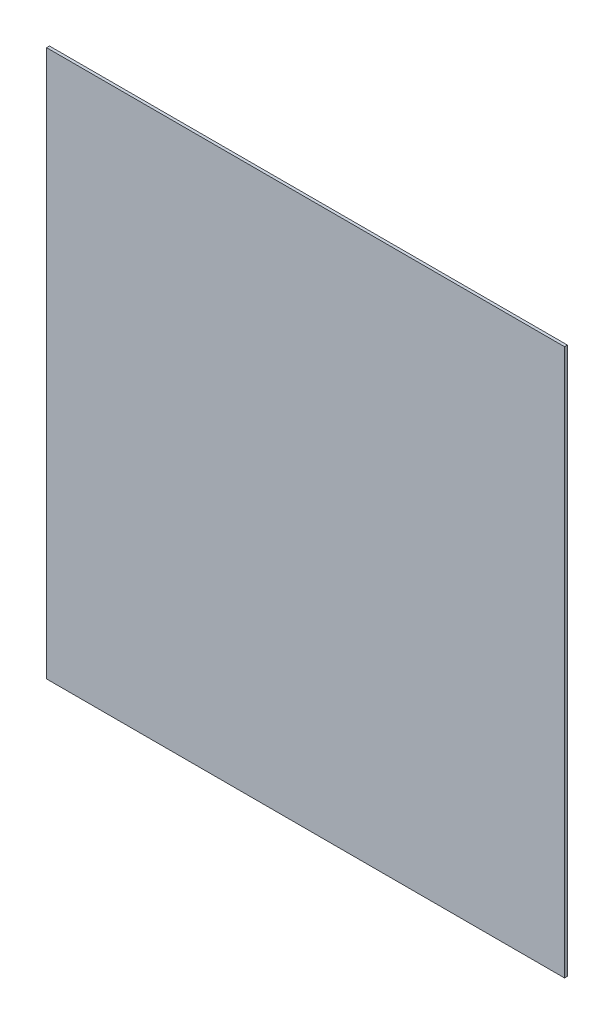
ISO-10303-21;
HEADER;
FILE_DESCRIPTION(('STEP AP214'),'2;1');
FILE_NAME('part.step','',(''),(''),'','','');
FILE_SCHEMA(('AUTOMOTIVE_DESIGN { 1 0 10303 214 1 1 1 1 }'));
ENDSEC;
DATA;
#1=APPLICATION_CONTEXT('core data for automotive mechanical design processes');
#2=APPLICATION_PROTOCOL_DEFINITION('international standard','automotive_design',2000,#1);
#3=PRODUCT_CONTEXT('',#1,'mechanical');
#4=PRODUCT('Part','Part','',(#3));
#5=PRODUCT_RELATED_PRODUCT_CATEGORY('part','',(#4));
#6=PRODUCT_DEFINITION_FORMATION('','',#4);
#7=PRODUCT_DEFINITION_CONTEXT('part definition',#1,'design');
#8=PRODUCT_DEFINITION('design','',#6,#7);
#9=PRODUCT_DEFINITION_SHAPE('','',#8);
#10=(LENGTH_UNIT() NAMED_UNIT(*) SI_UNIT(.MILLI.,.METRE.));
#11=(NAMED_UNIT(*) PLANE_ANGLE_UNIT() SI_UNIT($,.RADIAN.));
#12=(NAMED_UNIT(*) SI_UNIT($,.STERADIAN.) SOLID_ANGLE_UNIT());
#13=UNCERTAINTY_MEASURE_WITH_UNIT(LENGTH_MEASURE(1.E-05),#10,'distance_accuracy_value','');
#14=(GEOMETRIC_REPRESENTATION_CONTEXT(3) GLOBAL_UNCERTAINTY_ASSIGNED_CONTEXT((#13)) GLOBAL_UNIT_ASSIGNED_CONTEXT((#10,
#11,#12)) REPRESENTATION_CONTEXT('',''));
#15=CARTESIAN_POINT('',(0.,0.,0.));
#16=DIRECTION('',(0.,0.,1.));
#17=DIRECTION('',(1.,0.,0.));
#18=AXIS2_PLACEMENT_3D('',#15,#16,#17);
#19=CARTESIAN_POINT('',(0.,0.,0.0862000000000108));
#20=DIRECTION('',(0.,0.,1.));
#21=DIRECTION('',(1.,0.,0.));
#22=AXIS2_PLACEMENT_3D('',#19,#20,#21);
#23=PLANE('',#22);
#24=DIRECTION('',(0.,1.,0.));
#25=VECTOR('',#24,1.);
#26=CARTESIAN_POINT('',(2.0500086,-1.2599924,0.0862000000000108));
#27=LINE('',#26,#25);
#28=CARTESIAN_POINT('',(2.0500086,0.6400038,0.0862000000000108));
#29=VERTEX_POINT('',#28);
#30=CARTESIAN_POINT('',(2.0500086,-1.2599924,0.0862000000000108));
#31=VERTEX_POINT('',#30);
#32=EDGE_CURVE('E68',#29,#31,#27,.F.);
#33=ORIENTED_EDGE('',*,*,#32,.F.);
#34=DIRECTION('',(1.,0.,0.));
#35=VECTOR('',#34,1.);
#36=CARTESIAN_POINT('',(2.0500086,0.6400038,0.0862000000000108));
#37=LINE('',#36,#35);
#38=CARTESIAN_POINT('',(0.2500122,0.6400038,0.0862000000000108));
#39=VERTEX_POINT('',#38);
#40=EDGE_CURVE('E20',#39,#29,#37,.T.);
#41=ORIENTED_EDGE('',*,*,#40,.F.);
#42=DIRECTION('',(0.,1.,0.));
#43=VECTOR('',#42,1.);
#44=CARTESIAN_POINT('',(0.2500122,0.6400038,0.0862000000000108));
#45=LINE('',#44,#43);
#46=CARTESIAN_POINT('',(0.2500122,-1.2599924,0.0862000000000108));
#47=VERTEX_POINT('',#46);
#48=EDGE_CURVE('E58',#47,#39,#45,.T.);
#49=ORIENTED_EDGE('',*,*,#48,.F.);
#50=DIRECTION('',(1.,0.,0.));
#51=VECTOR('',#50,1.);
#52=CARTESIAN_POINT('',(0.2500122,-1.2599924,0.0862000000000108));
#53=LINE('',#52,#51);
#54=EDGE_CURVE('E53',#31,#47,#53,.F.);
#55=ORIENTED_EDGE('',*,*,#54,.F.);
#56=EDGE_LOOP('',(#33,#41,#49,#55));
#57=FACE_BOUND('',#56,.T.);
#58=ADVANCED_FACE('F17',(#57),#23,.T.);
#59=CARTESIAN_POINT('',(2.0500086,0.6400038,0.0762));
#60=DIRECTION('',(0.,1.,0.));
#61=DIRECTION('',(0.,0.,1.));
#62=AXIS2_PLACEMENT_3D('',#59,#60,#61);
#63=PLANE('',#62);
#64=DIRECTION('',(0.,0.,-1.));
#65=VECTOR('',#64,1.);
#66=CARTESIAN_POINT('',(2.0500086,0.6400038,0.0762));
#67=LINE('',#66,#65);
#68=CARTESIAN_POINT('',(2.0500086,0.6400038,0.0762));
#69=VERTEX_POINT('',#68);
#70=EDGE_CURVE('E79',#69,#29,#67,.F.);
#71=ORIENTED_EDGE('',*,*,#70,.F.);
#72=DIRECTION('',(1.,0.,0.));
#73=VECTOR('',#72,1.);
#74=CARTESIAN_POINT('',(0.,0.6400038,0.0762));
#75=LINE('',#74,#73);
#76=CARTESIAN_POINT('',(0.2500122,0.6400038,0.0762));
#77=VERTEX_POINT('',#76);
#78=EDGE_CURVE('E74',#69,#77,#75,.F.);
#79=ORIENTED_EDGE('',*,*,#78,.T.);
#80=DIRECTION('',(0.,0.,1.));
#81=VECTOR('',#80,1.);
#82=CARTESIAN_POINT('',(0.2500122,0.6400038,0.0762));
#83=LINE('',#82,#81);
#84=EDGE_CURVE('E63',#39,#77,#83,.F.);
#85=ORIENTED_EDGE('',*,*,#84,.F.);
#86=ORIENTED_EDGE('',*,*,#40,.T.);
#87=EDGE_LOOP('',(#71,#79,#85,#86));
#88=FACE_BOUND('',#87,.T.);
#89=ADVANCED_FACE('F73',(#88),#63,.T.);
#90=CARTESIAN_POINT('',(0.2500122,0.6400038,0.0762));
#91=DIRECTION('',(-1.,0.,0.));
#92=DIRECTION('',(0.,0.,1.));
#93=AXIS2_PLACEMENT_3D('',#90,#91,#92);
#94=PLANE('',#93);
#95=ORIENTED_EDGE('',*,*,#84,.T.);
#96=DIRECTION('',(0.,1.,0.));
#97=VECTOR('',#96,1.);
#98=CARTESIAN_POINT('',(0.2500122,0.,0.0762));
#99=LINE('',#98,#97);
#100=CARTESIAN_POINT('',(0.2500122,-1.2599924,0.0762));
#101=VERTEX_POINT('',#100);
#102=EDGE_CURVE('E84',#77,#101,#99,.F.);
#103=ORIENTED_EDGE('',*,*,#102,.T.);
#104=DIRECTION('',(0.,0.,-1.));
#105=VECTOR('',#104,1.);
#106=CARTESIAN_POINT('',(0.2500122,-1.2599924,0.0762));
#107=LINE('',#106,#105);
#108=EDGE_CURVE('E65',#47,#101,#107,.T.);
#109=ORIENTED_EDGE('',*,*,#108,.F.);
#110=ORIENTED_EDGE('',*,*,#48,.T.);
#111=EDGE_LOOP('',(#95,#103,#109,#110));
#112=FACE_BOUND('',#111,.T.);
#113=ADVANCED_FACE('F60',(#112),#94,.T.);
#114=CARTESIAN_POINT('',(0.2500122,-1.2599924,0.0762));
#115=DIRECTION('',(0.,-1.,0.));
#116=DIRECTION('',(0.,0.,-1.));
#117=AXIS2_PLACEMENT_3D('',#114,#115,#116);
#118=PLANE('',#117);
#119=ORIENTED_EDGE('',*,*,#108,.T.);
#120=DIRECTION('',(1.,0.,0.));
#121=VECTOR('',#120,1.);
#122=CARTESIAN_POINT('',(0.,-1.2599924,0.0762));
#123=LINE('',#122,#121);
#124=CARTESIAN_POINT('',(2.0500086,-1.2599924,0.0762));
#125=VERTEX_POINT('',#124);
#126=EDGE_CURVE('E26',#101,#125,#123,.T.);
#127=ORIENTED_EDGE('',*,*,#126,.T.);
#128=DIRECTION('',(0.,0.,-1.));
#129=VECTOR('',#128,1.);
#130=CARTESIAN_POINT('',(2.0500086,-1.2599924,0.0762));
#131=LINE('',#130,#129);
#132=EDGE_CURVE('E34',#31,#125,#131,.T.);
#133=ORIENTED_EDGE('',*,*,#132,.F.);
#134=ORIENTED_EDGE('',*,*,#54,.T.);
#135=EDGE_LOOP('',(#119,#127,#133,#134));
#136=FACE_BOUND('',#135,.T.);
#137=ADVANCED_FACE('F88',(#136),#118,.T.);
#138=CARTESIAN_POINT('',(2.0500086,-1.2599924,0.0762));
#139=DIRECTION('',(1.,0.,0.));
#140=DIRECTION('',(0.,0.,-1.));
#141=AXIS2_PLACEMENT_3D('',#138,#139,#140);
#142=PLANE('',#141);
#143=ORIENTED_EDGE('',*,*,#132,.T.);
#144=DIRECTION('',(0.,1.,0.));
#145=VECTOR('',#144,1.);
#146=CARTESIAN_POINT('',(2.0500086,0.,0.0762));
#147=LINE('',#146,#145);
#148=EDGE_CURVE('E11',#125,#69,#147,.T.);
#149=ORIENTED_EDGE('',*,*,#148,.T.);
#150=ORIENTED_EDGE('',*,*,#70,.T.);
#151=ORIENTED_EDGE('',*,*,#32,.T.);
#152=EDGE_LOOP('',(#143,#149,#150,#151));
#153=FACE_BOUND('',#152,.T.);
#154=ADVANCED_FACE('F91',(#153),#142,.T.);
#155=CARTESIAN_POINT('',(0.,0.,0.0762));
#156=DIRECTION('',(0.,0.,1.));
#157=DIRECTION('',(1.,0.,0.));
#158=AXIS2_PLACEMENT_3D('',#155,#156,#157);
#159=PLANE('',#158);
#160=ORIENTED_EDGE('',*,*,#126,.F.);
#161=ORIENTED_EDGE('',*,*,#102,.F.);
#162=ORIENTED_EDGE('',*,*,#78,.F.);
#163=ORIENTED_EDGE('',*,*,#148,.F.);
#164=EDGE_LOOP('',(#160,#161,#162,#163));
#165=FACE_BOUND('',#164,.T.);
#166=ADVANCED_FACE('F90',(#165),#159,.F.);
#167=CLOSED_SHELL('',(#58,#89,#113,#137,#154,#166));
#168=MANIFOLD_SOLID_BREP('B1',#167);
#169=ADVANCED_BREP_SHAPE_REPRESENTATION('',(#18,#168),#14);
#170=SHAPE_DEFINITION_REPRESENTATION(#9,#169);
ENDSEC;
END-ISO-10303-21;
